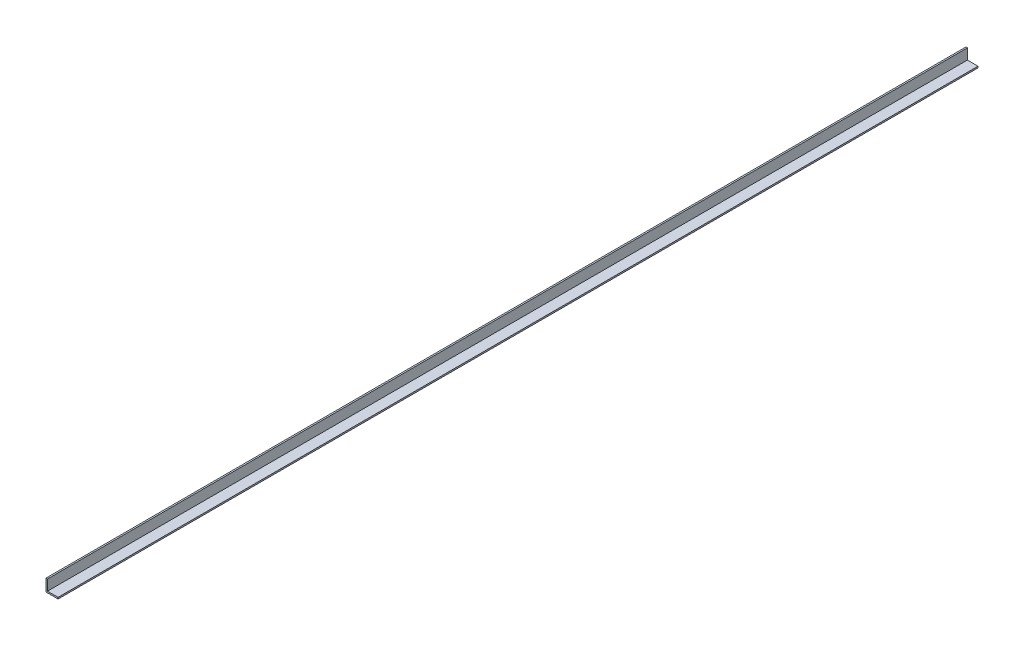
ISO-10303-21;
HEADER;
FILE_DESCRIPTION(('STEP AP214'),'2;1');
FILE_NAME('part.step','',(''),(''),'','','');
FILE_SCHEMA(('AUTOMOTIVE_DESIGN { 1 0 10303 214 1 1 1 1 }'));
ENDSEC;
DATA;
#1=APPLICATION_CONTEXT('core data for automotive mechanical design processes');
#2=APPLICATION_PROTOCOL_DEFINITION('international standard','automotive_design',2000,#1);
#3=PRODUCT_CONTEXT('',#1,'mechanical');
#4=PRODUCT('Part','Part','',(#3));
#5=PRODUCT_RELATED_PRODUCT_CATEGORY('part','',(#4));
#6=PRODUCT_DEFINITION_FORMATION('','',#4);
#7=PRODUCT_DEFINITION_CONTEXT('part definition',#1,'design');
#8=PRODUCT_DEFINITION('design','',#6,#7);
#9=PRODUCT_DEFINITION_SHAPE('','',#8);
#10=(LENGTH_UNIT() NAMED_UNIT(*) SI_UNIT(.MILLI.,.METRE.));
#11=(NAMED_UNIT(*) PLANE_ANGLE_UNIT() SI_UNIT($,.RADIAN.));
#12=(NAMED_UNIT(*) SI_UNIT($,.STERADIAN.) SOLID_ANGLE_UNIT());
#13=UNCERTAINTY_MEASURE_WITH_UNIT(LENGTH_MEASURE(1.E-05),#10,'distance_accuracy_value','');
#14=(GEOMETRIC_REPRESENTATION_CONTEXT(3) GLOBAL_UNCERTAINTY_ASSIGNED_CONTEXT((#13)) GLOBAL_UNIT_ASSIGNED_CONTEXT((#10,
#11,#12)) REPRESENTATION_CONTEXT('',''));
#15=CARTESIAN_POINT('',(0.,0.,0.));
#16=DIRECTION('',(0.,0.,1.));
#17=DIRECTION('',(1.,0.,0.));
#18=AXIS2_PLACEMENT_3D('',#15,#16,#17);
#19=CARTESIAN_POINT('',(25.4,0.,1930.4));
#20=DIRECTION('',(0.,1.,0.));
#21=DIRECTION('',(-1.,0.,0.));
#22=AXIS2_PLACEMENT_3D('',#19,#20,#21);
#23=PLANE('',#22);
#24=DIRECTION('',(1.,0.,0.));
#25=VECTOR('',#24,1.);
#26=CARTESIAN_POINT('',(25.4,0.,0.));
#27=LINE('',#26,#25);
#28=CARTESIAN_POINT('',(0.,0.,0.));
#29=VERTEX_POINT('',#28);
#30=CARTESIAN_POINT('',(25.4,0.,0.));
#31=VERTEX_POINT('',#30);
#32=EDGE_CURVE('E117',#29,#31,#27,.T.);
#33=ORIENTED_EDGE('',*,*,#32,.T.);
#34=DIRECTION('',(0.,0.,-1.));
#35=VECTOR('',#34,1.);
#36=CARTESIAN_POINT('',(25.4,0.,1930.4));
#37=LINE('',#36,#35);
#38=CARTESIAN_POINT('',(25.4,0.,1930.4));
#39=VERTEX_POINT('',#38);
#40=EDGE_CURVE('E11',#39,#31,#37,.T.);
#41=ORIENTED_EDGE('',*,*,#40,.F.);
#42=DIRECTION('',(1.,0.,0.));
#43=VECTOR('',#42,1.);
#44=CARTESIAN_POINT('',(25.4,0.,1930.4));
#45=LINE('',#44,#43);
#46=CARTESIAN_POINT('',(0.,0.,1930.4));
#47=VERTEX_POINT('',#46);
#48=EDGE_CURVE('E127',#47,#39,#45,.T.);
#49=ORIENTED_EDGE('',*,*,#48,.F.);
#50=DIRECTION('',(0.,0.,-1.));
#51=VECTOR('',#50,1.);
#52=CARTESIAN_POINT('',(0.,0.,1930.4));
#53=LINE('',#52,#51);
#54=EDGE_CURVE('E113',#47,#29,#53,.T.);
#55=ORIENTED_EDGE('',*,*,#54,.T.);
#56=EDGE_LOOP('',(#33,#41,#49,#55));
#57=FACE_BOUND('',#56,.T.);
#58=ADVANCED_FACE('F33',(#57),#23,.F.);
#59=CARTESIAN_POINT('',(25.4,3.175,1930.4));
#60=DIRECTION('',(-1.,0.,0.));
#61=DIRECTION('',(0.,0.,1.));
#62=AXIS2_PLACEMENT_3D('',#59,#60,#61);
#63=PLANE('',#62);
#64=DIRECTION('',(0.,1.,0.));
#65=VECTOR('',#64,1.);
#66=CARTESIAN_POINT('',(25.4,3.175,0.));
#67=LINE('',#66,#65);
#68=CARTESIAN_POINT('',(25.4,3.175,0.));
#69=VERTEX_POINT('',#68);
#70=EDGE_CURVE('E120',#31,#69,#67,.T.);
#71=ORIENTED_EDGE('',*,*,#70,.T.);
#72=DIRECTION('',(0.,0.,-1.));
#73=VECTOR('',#72,1.);
#74=CARTESIAN_POINT('',(25.4,3.175,1930.4));
#75=LINE('',#74,#73);
#76=CARTESIAN_POINT('',(25.4,3.175,1930.4));
#77=VERTEX_POINT('',#76);
#78=EDGE_CURVE('E41',#77,#69,#75,.T.);
#79=ORIENTED_EDGE('',*,*,#78,.F.);
#80=DIRECTION('',(0.,1.,0.));
#81=VECTOR('',#80,1.);
#82=CARTESIAN_POINT('',(25.4,3.175,1930.4));
#83=LINE('',#82,#81);
#84=EDGE_CURVE('E86',#39,#77,#83,.T.);
#85=ORIENTED_EDGE('',*,*,#84,.F.);
#86=ORIENTED_EDGE('',*,*,#40,.T.);
#87=EDGE_LOOP('',(#71,#79,#85,#86));
#88=FACE_BOUND('',#87,.T.);
#89=ADVANCED_FACE('F151',(#88),#63,.F.);
#90=CARTESIAN_POINT('',(3.175,3.175,1930.4));
#91=DIRECTION('',(0.,-1.,0.));
#92=DIRECTION('',(0.,0.,-1.));
#93=AXIS2_PLACEMENT_3D('',#90,#91,#92);
#94=PLANE('',#93);
#95=DIRECTION('',(-1.,0.,0.));
#96=VECTOR('',#95,1.);
#97=CARTESIAN_POINT('',(3.175,3.175,0.));
#98=LINE('',#97,#96);
#99=CARTESIAN_POINT('',(3.175,3.175,0.));
#100=VERTEX_POINT('',#99);
#101=EDGE_CURVE('E122',#69,#100,#98,.T.);
#102=ORIENTED_EDGE('',*,*,#101,.T.);
#103=DIRECTION('',(0.,0.,-1.));
#104=VECTOR('',#103,1.);
#105=CARTESIAN_POINT('',(3.175,3.175,1930.4));
#106=LINE('',#105,#104);
#107=CARTESIAN_POINT('',(3.175,3.175,1930.4));
#108=VERTEX_POINT('',#107);
#109=EDGE_CURVE('E108',#108,#100,#106,.T.);
#110=ORIENTED_EDGE('',*,*,#109,.F.);
#111=DIRECTION('',(-1.,0.,0.));
#112=VECTOR('',#111,1.);
#113=CARTESIAN_POINT('',(3.175,3.175,1930.4));
#114=LINE('',#113,#112);
#115=EDGE_CURVE('E99',#77,#108,#114,.T.);
#116=ORIENTED_EDGE('',*,*,#115,.F.);
#117=ORIENTED_EDGE('',*,*,#78,.T.);
#118=EDGE_LOOP('',(#102,#110,#116,#117));
#119=FACE_BOUND('',#118,.T.);
#120=ADVANCED_FACE('F133',(#119),#94,.F.);
#121=CARTESIAN_POINT('',(3.175,25.4,1930.4));
#122=DIRECTION('',(-1.,0.,0.));
#123=DIRECTION('',(0.,-1.,0.));
#124=AXIS2_PLACEMENT_3D('',#121,#122,#123);
#125=PLANE('',#124);
#126=DIRECTION('',(0.,1.,0.));
#127=VECTOR('',#126,1.);
#128=CARTESIAN_POINT('',(3.175,25.4,0.));
#129=LINE('',#128,#127);
#130=CARTESIAN_POINT('',(3.175,25.4,0.));
#131=VERTEX_POINT('',#130);
#132=EDGE_CURVE('E107',#100,#131,#129,.T.);
#133=ORIENTED_EDGE('',*,*,#132,.T.);
#134=DIRECTION('',(0.,0.,-1.));
#135=VECTOR('',#134,1.);
#136=CARTESIAN_POINT('',(3.175,25.4,1930.4));
#137=LINE('',#136,#135);
#138=CARTESIAN_POINT('',(3.175,25.4,1930.4));
#139=VERTEX_POINT('',#138);
#140=EDGE_CURVE('E104',#139,#131,#137,.T.);
#141=ORIENTED_EDGE('',*,*,#140,.F.);
#142=DIRECTION('',(0.,1.,0.));
#143=VECTOR('',#142,1.);
#144=CARTESIAN_POINT('',(3.175,25.4,1930.4));
#145=LINE('',#144,#143);
#146=EDGE_CURVE('E93',#108,#139,#145,.T.);
#147=ORIENTED_EDGE('',*,*,#146,.F.);
#148=ORIENTED_EDGE('',*,*,#109,.T.);
#149=EDGE_LOOP('',(#133,#141,#147,#148));
#150=FACE_BOUND('',#149,.T.);
#151=ADVANCED_FACE('F105',(#150),#125,.F.);
#152=CARTESIAN_POINT('',(0.,25.4,1930.4));
#153=DIRECTION('',(0.,-1.,0.));
#154=DIRECTION('',(0.,0.,-1.));
#155=AXIS2_PLACEMENT_3D('',#152,#153,#154);
#156=PLANE('',#155);
#157=DIRECTION('',(-1.,0.,0.));
#158=VECTOR('',#157,1.);
#159=CARTESIAN_POINT('',(0.,25.4,0.));
#160=LINE('',#159,#158);
#161=CARTESIAN_POINT('',(0.,25.4,0.));
#162=VERTEX_POINT('',#161);
#163=EDGE_CURVE('E72',#131,#162,#160,.T.);
#164=ORIENTED_EDGE('',*,*,#163,.T.);
#165=DIRECTION('',(0.,0.,-1.));
#166=VECTOR('',#165,1.);
#167=CARTESIAN_POINT('',(0.,25.4,1930.4));
#168=LINE('',#167,#166);
#169=CARTESIAN_POINT('',(0.,25.4,1930.4));
#170=VERTEX_POINT('',#169);
#171=EDGE_CURVE('E109',#170,#162,#168,.T.);
#172=ORIENTED_EDGE('',*,*,#171,.F.);
#173=DIRECTION('',(-1.,0.,0.));
#174=VECTOR('',#173,1.);
#175=CARTESIAN_POINT('',(0.,25.4,1930.4));
#176=LINE('',#175,#174);
#177=EDGE_CURVE('E97',#139,#170,#176,.T.);
#178=ORIENTED_EDGE('',*,*,#177,.F.);
#179=ORIENTED_EDGE('',*,*,#140,.T.);
#180=EDGE_LOOP('',(#164,#172,#178,#179));
#181=FACE_BOUND('',#180,.T.);
#182=ADVANCED_FACE('F111',(#181),#156,.F.);
#183=CARTESIAN_POINT('',(0.,0.,1930.4));
#184=DIRECTION('',(1.,0.,0.));
#185=DIRECTION('',(0.,0.,-1.));
#186=AXIS2_PLACEMENT_3D('',#183,#184,#185);
#187=PLANE('',#186);
#188=DIRECTION('',(0.,-1.,0.));
#189=VECTOR('',#188,1.);
#190=CARTESIAN_POINT('',(0.,0.,0.));
#191=LINE('',#190,#189);
#192=EDGE_CURVE('E78',#162,#29,#191,.T.);
#193=ORIENTED_EDGE('',*,*,#192,.T.);
#194=ORIENTED_EDGE('',*,*,#54,.F.);
#195=DIRECTION('',(0.,-1.,0.));
#196=VECTOR('',#195,1.);
#197=CARTESIAN_POINT('',(0.,0.,1930.4));
#198=LINE('',#197,#196);
#199=EDGE_CURVE('E49',#170,#47,#198,.T.);
#200=ORIENTED_EDGE('',*,*,#199,.F.);
#201=ORIENTED_EDGE('',*,*,#171,.T.);
#202=EDGE_LOOP('',(#193,#194,#200,#201));
#203=FACE_BOUND('',#202,.T.);
#204=ADVANCED_FACE('F140',(#203),#187,.F.);
#205=CARTESIAN_POINT('',(0.,0.,1930.4));
#206=DIRECTION('',(0.,0.,-1.));
#207=DIRECTION('',(-1.,0.,0.));
#208=AXIS2_PLACEMENT_3D('',#205,#206,#207);
#209=PLANE('',#208);
#210=ORIENTED_EDGE('',*,*,#48,.T.);
#211=ORIENTED_EDGE('',*,*,#84,.T.);
#212=ORIENTED_EDGE('',*,*,#115,.T.);
#213=ORIENTED_EDGE('',*,*,#146,.T.);
#214=ORIENTED_EDGE('',*,*,#177,.T.);
#215=ORIENTED_EDGE('',*,*,#199,.T.);
#216=EDGE_LOOP('',(#210,#211,#212,#213,#214,#215));
#217=FACE_BOUND('',#216,.T.);
#218=ADVANCED_FACE('F95',(#217),#209,.F.);
#219=CARTESIAN_POINT('',(0.,0.,0.));
#220=DIRECTION('',(0.,0.,-1.));
#221=DIRECTION('',(-1.,0.,0.));
#222=AXIS2_PLACEMENT_3D('',#219,#220,#221);
#223=PLANE('',#222);
#224=ORIENTED_EDGE('',*,*,#32,.F.);
#225=ORIENTED_EDGE('',*,*,#192,.F.);
#226=ORIENTED_EDGE('',*,*,#163,.F.);
#227=ORIENTED_EDGE('',*,*,#132,.F.);
#228=ORIENTED_EDGE('',*,*,#101,.F.);
#229=ORIENTED_EDGE('',*,*,#70,.F.);
#230=EDGE_LOOP('',(#224,#225,#226,#227,#228,#229));
#231=FACE_BOUND('',#230,.T.);
#232=ADVANCED_FACE('F136',(#231),#223,.T.);
#233=CLOSED_SHELL('',(#58,#89,#120,#151,#182,#204,#218,#232));
#234=MANIFOLD_SOLID_BREP('B2',#233);
#235=ADVANCED_BREP_SHAPE_REPRESENTATION('',(#18,#234),#14);
#236=SHAPE_DEFINITION_REPRESENTATION(#9,#235);
ENDSEC;
END-ISO-10303-21;
